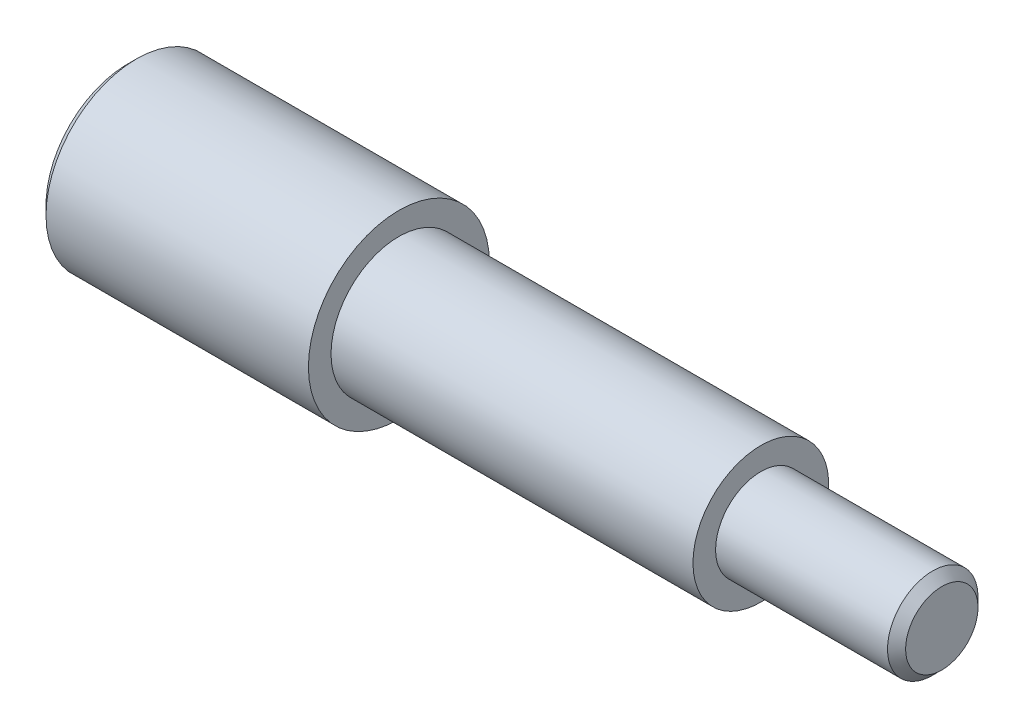
ISO-10303-21;
HEADER;
FILE_DESCRIPTION(('STEP AP214'),'2;1');
FILE_NAME('part.step','',(''),(''),'','','');
FILE_SCHEMA(('AUTOMOTIVE_DESIGN { 1 0 10303 214 1 1 1 1 }'));
ENDSEC;
DATA;
#1=APPLICATION_CONTEXT('core data for automotive mechanical design processes');
#2=APPLICATION_PROTOCOL_DEFINITION('international standard','automotive_design',2000,#1);
#3=PRODUCT_CONTEXT('',#1,'mechanical');
#4=PRODUCT('Part','Part','',(#3));
#5=PRODUCT_RELATED_PRODUCT_CATEGORY('part','',(#4));
#6=PRODUCT_DEFINITION_FORMATION('','',#4);
#7=PRODUCT_DEFINITION_CONTEXT('part definition',#1,'design');
#8=PRODUCT_DEFINITION('design','',#6,#7);
#9=PRODUCT_DEFINITION_SHAPE('','',#8);
#10=(LENGTH_UNIT() NAMED_UNIT(*) SI_UNIT(.MILLI.,.METRE.));
#11=(NAMED_UNIT(*) PLANE_ANGLE_UNIT() SI_UNIT($,.RADIAN.));
#12=(NAMED_UNIT(*) SI_UNIT($,.STERADIAN.) SOLID_ANGLE_UNIT());
#13=UNCERTAINTY_MEASURE_WITH_UNIT(LENGTH_MEASURE(1.E-05),#10,'distance_accuracy_value','');
#14=(GEOMETRIC_REPRESENTATION_CONTEXT(3) GLOBAL_UNCERTAINTY_ASSIGNED_CONTEXT((#13)) GLOBAL_UNIT_ASSIGNED_CONTEXT((#10,
#11,#12)) REPRESENTATION_CONTEXT('',''));
#15=CARTESIAN_POINT('',(0.,0.,0.));
#16=DIRECTION('',(0.,0.,1.));
#17=DIRECTION('',(1.,0.,0.));
#18=AXIS2_PLACEMENT_3D('',#15,#16,#17);
#19=CARTESIAN_POINT('',(0.,0.,0.));
#20=DIRECTION('',(1.,0.,0.));
#21=DIRECTION('',(0.,0.,-1.));
#22=AXIS2_PLACEMENT_3D('',#19,#20,#21);
#23=PLANE('',#22);
#24=CARTESIAN_POINT('',(0.,0.,0.));
#25=DIRECTION('',(1.,0.,0.));
#26=DIRECTION('',(0.,0.,-1.));
#27=AXIS2_PLACEMENT_3D('',#24,#25,#26);
#28=CIRCLE('',#27,11.43);
#29=CARTESIAN_POINT('',(0.,0.,-11.43));
#30=VERTEX_POINT('',#29);
#31=EDGE_CURVE('E47',#30,#30,#28,.F.);
#32=ORIENTED_EDGE('',*,*,#31,.T.);
#33=EDGE_LOOP('',(#32));
#34=FACE_BOUND('',#33,.T.);
#35=ADVANCED_FACE('F41',(#34),#23,.F.);
#36=CARTESIAN_POINT('',(0.,0.,0.));
#37=DIRECTION('',(-1.,0.,0.));
#38=DIRECTION('',(0.,0.,1.));
#39=AXIS2_PLACEMENT_3D('',#36,#37,#38);
#40=CYLINDRICAL_SURFACE('',#39,12.7);
#41=CARTESIAN_POINT('',(1.27000000000001,0.,0.));
#42=DIRECTION('',(1.,0.,0.));
#43=DIRECTION('',(0.,0.,-1.));
#44=AXIS2_PLACEMENT_3D('',#41,#42,#43);
#45=CIRCLE('',#44,12.7);
#46=CARTESIAN_POINT('',(1.27000000000001,0.,-12.7));
#47=VERTEX_POINT('',#46);
#48=EDGE_CURVE('E10',#47,#47,#45,.T.);
#49=ORIENTED_EDGE('',*,*,#48,.T.);
#50=EDGE_LOOP('',(#49));
#51=FACE_BOUND('',#50,.T.);
#52=CARTESIAN_POINT('',(38.1,0.,0.));
#53=DIRECTION('',(-1.,0.,0.));
#54=DIRECTION('',(0.,0.,1.));
#55=AXIS2_PLACEMENT_3D('',#52,#53,#54);
#56=CIRCLE('',#55,12.7);
#57=CARTESIAN_POINT('',(38.1,0.,12.7));
#58=VERTEX_POINT('',#57);
#59=EDGE_CURVE('E65',#58,#58,#56,.T.);
#60=ORIENTED_EDGE('',*,*,#59,.T.);
#61=EDGE_LOOP('',(#60));
#62=FACE_BOUND('',#61,.T.);
#63=ADVANCED_FACE('F94',(#51,#62),#40,.T.);
#64=CARTESIAN_POINT('',(38.1,12.7,0.));
#65=DIRECTION('',(-1.,0.,0.));
#66=DIRECTION('',(0.,0.,1.));
#67=AXIS2_PLACEMENT_3D('',#64,#65,#66);
#68=PLANE('',#67);
#69=ORIENTED_EDGE('',*,*,#59,.F.);
#70=EDGE_LOOP('',(#69));
#71=FACE_BOUND('',#70,.T.);
#72=CARTESIAN_POINT('',(38.1,0.,0.));
#73=DIRECTION('',(-1.,0.,0.));
#74=DIRECTION('',(0.,0.,1.));
#75=AXIS2_PLACEMENT_3D('',#72,#73,#74);
#76=CIRCLE('',#75,9.525);
#77=CARTESIAN_POINT('',(38.1,0.,9.525));
#78=VERTEX_POINT('',#77);
#79=EDGE_CURVE('E63',#78,#78,#76,.T.);
#80=ORIENTED_EDGE('',*,*,#79,.T.);
#81=EDGE_LOOP('',(#80));
#82=FACE_BOUND('',#81,.T.);
#83=ADVANCED_FACE('F98',(#71,#82),#68,.F.);
#84=CARTESIAN_POINT('',(0.,0.,0.));
#85=DIRECTION('',(-1.,0.,0.));
#86=DIRECTION('',(0.,0.,1.));
#87=AXIS2_PLACEMENT_3D('',#84,#85,#86);
#88=CYLINDRICAL_SURFACE('',#87,9.525);
#89=ORIENTED_EDGE('',*,*,#79,.F.);
#90=EDGE_LOOP('',(#89));
#91=FACE_BOUND('',#90,.T.);
#92=CARTESIAN_POINT('',(88.9,0.,0.));
#93=DIRECTION('',(-1.,0.,0.));
#94=DIRECTION('',(0.,0.,1.));
#95=AXIS2_PLACEMENT_3D('',#92,#93,#94);
#96=CIRCLE('',#95,9.525);
#97=CARTESIAN_POINT('',(88.9,0.,9.525));
#98=VERTEX_POINT('',#97);
#99=EDGE_CURVE('E66',#98,#98,#96,.T.);
#100=ORIENTED_EDGE('',*,*,#99,.T.);
#101=EDGE_LOOP('',(#100));
#102=FACE_BOUND('',#101,.T.);
#103=ADVANCED_FACE('F89',(#91,#102),#88,.T.);
#104=CARTESIAN_POINT('',(88.9,9.525,0.));
#105=DIRECTION('',(-1.,0.,0.));
#106=DIRECTION('',(0.,0.,1.));
#107=AXIS2_PLACEMENT_3D('',#104,#105,#106);
#108=PLANE('',#107);
#109=ORIENTED_EDGE('',*,*,#99,.F.);
#110=EDGE_LOOP('',(#109));
#111=FACE_BOUND('',#110,.T.);
#112=CARTESIAN_POINT('',(88.9,0.,0.));
#113=DIRECTION('',(-1.,0.,0.));
#114=DIRECTION('',(0.,0.,1.));
#115=AXIS2_PLACEMENT_3D('',#112,#113,#114);
#116=CIRCLE('',#115,6.35);
#117=CARTESIAN_POINT('',(88.9,0.,6.35));
#118=VERTEX_POINT('',#117);
#119=EDGE_CURVE('E72',#118,#118,#116,.T.);
#120=ORIENTED_EDGE('',*,*,#119,.T.);
#121=EDGE_LOOP('',(#120));
#122=FACE_BOUND('',#121,.T.);
#123=ADVANCED_FACE('F73',(#111,#122),#108,.F.);
#124=CARTESIAN_POINT('',(0.,0.,0.));
#125=DIRECTION('',(-1.,0.,0.));
#126=DIRECTION('',(0.,0.,1.));
#127=AXIS2_PLACEMENT_3D('',#124,#125,#126);
#128=CYLINDRICAL_SURFACE('',#127,6.35);
#129=CARTESIAN_POINT('',(113.03,0.,0.));
#130=DIRECTION('',(-1.,0.,0.));
#131=DIRECTION('',(0.,0.,1.));
#132=AXIS2_PLACEMENT_3D('',#129,#130,#131);
#133=CIRCLE('',#132,6.35);
#134=CARTESIAN_POINT('',(113.03,0.,6.35));
#135=VERTEX_POINT('',#134);
#136=EDGE_CURVE('E60',#135,#135,#133,.T.);
#137=ORIENTED_EDGE('',*,*,#136,.T.);
#138=EDGE_LOOP('',(#137));
#139=FACE_BOUND('',#138,.T.);
#140=ORIENTED_EDGE('',*,*,#119,.F.);
#141=EDGE_LOOP('',(#140));
#142=FACE_BOUND('',#141,.T.);
#143=ADVANCED_FACE('F80',(#139,#142),#128,.T.);
#144=CARTESIAN_POINT('',(114.3,6.35,0.));
#145=DIRECTION('',(-1.,0.,0.));
#146=DIRECTION('',(0.,0.,1.));
#147=AXIS2_PLACEMENT_3D('',#144,#145,#146);
#148=PLANE('',#147);
#149=CARTESIAN_POINT('',(114.3,0.,0.));
#150=DIRECTION('',(-1.,0.,0.));
#151=DIRECTION('',(0.,0.,1.));
#152=AXIS2_PLACEMENT_3D('',#149,#150,#151);
#153=CIRCLE('',#152,5.08000000000003);
#154=CARTESIAN_POINT('',(114.3,0.,5.08000000000003));
#155=VERTEX_POINT('',#154);
#156=EDGE_CURVE('E52',#155,#155,#153,.F.);
#157=ORIENTED_EDGE('',*,*,#156,.T.);
#158=EDGE_LOOP('',(#157));
#159=FACE_BOUND('',#158,.T.);
#160=ADVANCED_FACE('F76',(#159),#148,.F.);
#161=CARTESIAN_POINT('',(113.03,0.,0.));
#162=DIRECTION('',(-1.,0.,0.));
#163=DIRECTION('',(0.,0.,1.));
#164=AXIS2_PLACEMENT_3D('',#161,#162,#163);
#165=CONICAL_SURFACE('',#164,6.35,0.785398163397445);
#166=ORIENTED_EDGE('',*,*,#156,.F.);
#167=EDGE_LOOP('',(#166));
#168=FACE_BOUND('',#167,.T.);
#169=ORIENTED_EDGE('',*,*,#136,.F.);
#170=EDGE_LOOP('',(#169));
#171=FACE_BOUND('',#170,.T.);
#172=ADVANCED_FACE('F88',(#168,#171),#165,.T.);
#173=CARTESIAN_POINT('',(0.,0.,0.));
#174=DIRECTION('',(1.,0.,0.));
#175=DIRECTION('',(0.,0.,-1.));
#176=AXIS2_PLACEMENT_3D('',#173,#174,#175);
#177=CONICAL_SURFACE('',#176,11.43,0.785398163397447);
#178=ORIENTED_EDGE('',*,*,#48,.F.);
#179=EDGE_LOOP('',(#178));
#180=FACE_BOUND('',#179,.T.);
#181=ORIENTED_EDGE('',*,*,#31,.F.);
#182=EDGE_LOOP('',(#181));
#183=FACE_BOUND('',#182,.T.);
#184=ADVANCED_FACE('F42',(#180,#183),#177,.T.);
#185=CLOSED_SHELL('',(#35,#63,#83,#103,#123,#143,#160,#172,#184));
#186=MANIFOLD_SOLID_BREP('B2',#185);
#187=ADVANCED_BREP_SHAPE_REPRESENTATION('',(#18,#186),#14);
#188=SHAPE_DEFINITION_REPRESENTATION(#9,#187);
ENDSEC;
END-ISO-10303-21;
